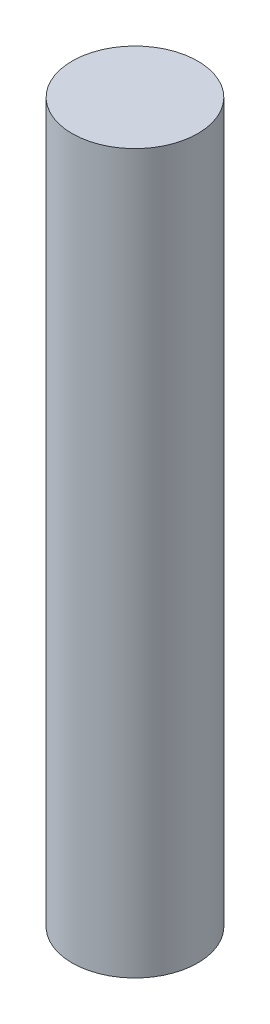
ISO-10303-21;
HEADER;
FILE_DESCRIPTION(('STEP AP214'),'2;1');
FILE_NAME('part.step','',(''),(''),'','','');
FILE_SCHEMA(('AUTOMOTIVE_DESIGN { 1 0 10303 214 1 1 1 1 }'));
ENDSEC;
DATA;
#1=APPLICATION_CONTEXT('core data for automotive mechanical design processes');
#2=APPLICATION_PROTOCOL_DEFINITION('international standard','automotive_design',2000,#1);
#3=PRODUCT_CONTEXT('',#1,'mechanical');
#4=PRODUCT('Part','Part','',(#3));
#5=PRODUCT_RELATED_PRODUCT_CATEGORY('part','',(#4));
#6=PRODUCT_DEFINITION_FORMATION('','',#4);
#7=PRODUCT_DEFINITION_CONTEXT('part definition',#1,'design');
#8=PRODUCT_DEFINITION('design','',#6,#7);
#9=PRODUCT_DEFINITION_SHAPE('','',#8);
#10=(LENGTH_UNIT() NAMED_UNIT(*) SI_UNIT(.MILLI.,.METRE.));
#11=(NAMED_UNIT(*) PLANE_ANGLE_UNIT() SI_UNIT($,.RADIAN.));
#12=(NAMED_UNIT(*) SI_UNIT($,.STERADIAN.) SOLID_ANGLE_UNIT());
#13=UNCERTAINTY_MEASURE_WITH_UNIT(LENGTH_MEASURE(1.E-05),#10,'distance_accuracy_value','');
#14=(GEOMETRIC_REPRESENTATION_CONTEXT(3) GLOBAL_UNCERTAINTY_ASSIGNED_CONTEXT((#13)) GLOBAL_UNIT_ASSIGNED_CONTEXT((#10,
#11,#12)) REPRESENTATION_CONTEXT('',''));
#15=CARTESIAN_POINT('',(0.,0.,0.));
#16=DIRECTION('',(0.,0.,1.));
#17=DIRECTION('',(1.,0.,0.));
#18=AXIS2_PLACEMENT_3D('',#15,#16,#17);
#19=CARTESIAN_POINT('',(0.,40.,0.));
#20=DIRECTION('',(0.,-1.,0.));
#21=DIRECTION('',(0.,0.,-1.));
#22=AXIS2_PLACEMENT_3D('',#19,#20,#21);
#23=CYLINDRICAL_SURFACE('',#22,3.5);
#24=CARTESIAN_POINT('',(0.,40.,0.));
#25=DIRECTION('',(0.,1.,0.));
#26=DIRECTION('',(0.,0.,1.));
#27=AXIS2_PLACEMENT_3D('',#24,#25,#26);
#28=CIRCLE('',#27,3.5);
#29=CARTESIAN_POINT('',(0.,40.,3.5));
#30=VERTEX_POINT('',#29);
#31=EDGE_CURVE('E10',#30,#30,#28,.T.);
#32=ORIENTED_EDGE('',*,*,#31,.F.);
#33=EDGE_LOOP('',(#32));
#34=FACE_BOUND('',#33,.T.);
#35=CARTESIAN_POINT('',(0.,0.,0.));
#36=DIRECTION('',(0.,1.,0.));
#37=DIRECTION('',(0.,0.,1.));
#38=AXIS2_PLACEMENT_3D('',#35,#36,#37);
#39=CIRCLE('',#38,3.5);
#40=CARTESIAN_POINT('',(0.,0.,3.5));
#41=VERTEX_POINT('',#40);
#42=EDGE_CURVE('E34',#41,#41,#39,.T.);
#43=ORIENTED_EDGE('',*,*,#42,.T.);
#44=EDGE_LOOP('',(#43));
#45=FACE_BOUND('',#44,.T.);
#46=ADVANCED_FACE('F31',(#34,#45),#23,.T.);
#47=CARTESIAN_POINT('',(0.,40.,0.));
#48=DIRECTION('',(0.,1.,0.));
#49=DIRECTION('',(0.,0.,1.));
#50=AXIS2_PLACEMENT_3D('',#47,#48,#49);
#51=PLANE('',#50);
#52=ORIENTED_EDGE('',*,*,#31,.T.);
#53=EDGE_LOOP('',(#52));
#54=FACE_BOUND('',#53,.T.);
#55=ADVANCED_FACE('F46',(#54),#51,.T.);
#56=CARTESIAN_POINT('',(0.,0.,0.));
#57=DIRECTION('',(0.,1.,0.));
#58=DIRECTION('',(0.,0.,1.));
#59=AXIS2_PLACEMENT_3D('',#56,#57,#58);
#60=PLANE('',#59);
#61=ORIENTED_EDGE('',*,*,#42,.F.);
#62=EDGE_LOOP('',(#61));
#63=FACE_BOUND('',#62,.T.);
#64=ADVANCED_FACE('F44',(#63),#60,.F.);
#65=CLOSED_SHELL('',(#46,#55,#64));
#66=MANIFOLD_SOLID_BREP('B2',#65);
#67=ADVANCED_BREP_SHAPE_REPRESENTATION('',(#18,#66),#14);
#68=SHAPE_DEFINITION_REPRESENTATION(#9,#67);
ENDSEC;
END-ISO-10303-21;
